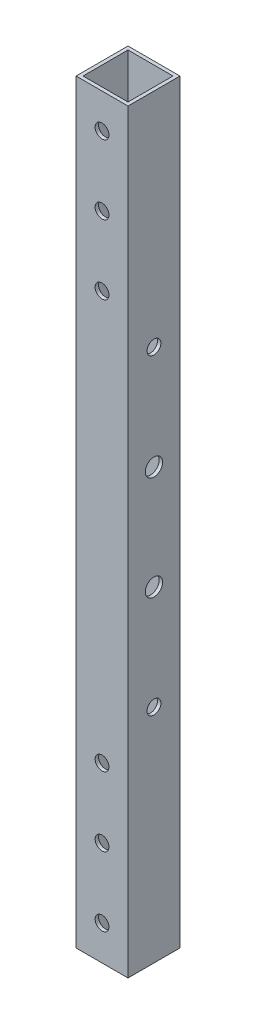
ISO-10303-21;
HEADER;
FILE_DESCRIPTION(('STEP AP214'),'2;1');
FILE_NAME('part.step','',(''),(''),'','','');
FILE_SCHEMA(('AUTOMOTIVE_DESIGN { 1 0 10303 214 1 1 1 1 }'));
ENDSEC;
DATA;
#1=APPLICATION_CONTEXT('core data for automotive mechanical design processes');
#2=APPLICATION_PROTOCOL_DEFINITION('international standard','automotive_design',2000,#1);
#3=PRODUCT_CONTEXT('',#1,'mechanical');
#4=PRODUCT('Part','Part','',(#3));
#5=PRODUCT_RELATED_PRODUCT_CATEGORY('part','',(#4));
#6=PRODUCT_DEFINITION_FORMATION('','',#4);
#7=PRODUCT_DEFINITION_CONTEXT('part definition',#1,'design');
#8=PRODUCT_DEFINITION('design','',#6,#7);
#9=PRODUCT_DEFINITION_SHAPE('','',#8);
#10=(LENGTH_UNIT() NAMED_UNIT(*) SI_UNIT(.MILLI.,.METRE.));
#11=(NAMED_UNIT(*) PLANE_ANGLE_UNIT() SI_UNIT($,.RADIAN.));
#12=(NAMED_UNIT(*) SI_UNIT($,.STERADIAN.) SOLID_ANGLE_UNIT());
#13=UNCERTAINTY_MEASURE_WITH_UNIT(LENGTH_MEASURE(1.E-05),#10,'distance_accuracy_value','');
#14=(GEOMETRIC_REPRESENTATION_CONTEXT(3) GLOBAL_UNCERTAINTY_ASSIGNED_CONTEXT((#13)) GLOBAL_UNIT_ASSIGNED_CONTEXT((#10,
#11,#12)) REPRESENTATION_CONTEXT('',''));
#15=CARTESIAN_POINT('',(0.,0.,0.));
#16=DIRECTION('',(0.,0.,1.));
#17=DIRECTION('',(1.,0.,0.));
#18=AXIS2_PLACEMENT_3D('',#15,#16,#17);
#19=CARTESIAN_POINT('',(0.,218.,0.));
#20=DIRECTION('',(0.,-1.,0.));
#21=DIRECTION('',(0.,0.,-1.));
#22=AXIS2_PLACEMENT_3D('',#19,#20,#21);
#23=PLANE('',#22);
#24=DIRECTION('',(0.,0.,-1.));
#25=VECTOR('',#24,1.);
#26=CARTESIAN_POINT('',(7.5,218.,7.5));
#27=LINE('',#26,#25);
#28=CARTESIAN_POINT('',(7.5,218.,7.5));
#29=VERTEX_POINT('',#28);
#30=CARTESIAN_POINT('',(7.5,218.,-7.5));
#31=VERTEX_POINT('',#30);
#32=EDGE_CURVE('E146',#29,#31,#27,.T.);
#33=ORIENTED_EDGE('',*,*,#32,.T.);
#34=DIRECTION('',(-1.,0.,0.));
#35=VECTOR('',#34,1.);
#36=CARTESIAN_POINT('',(-7.5,218.,-7.5));
#37=LINE('',#36,#35);
#38=CARTESIAN_POINT('',(-7.5,218.,-7.5));
#39=VERTEX_POINT('',#38);
#40=EDGE_CURVE('E149',#31,#39,#37,.T.);
#41=ORIENTED_EDGE('',*,*,#40,.T.);
#42=DIRECTION('',(0.,0.,1.));
#43=VECTOR('',#42,1.);
#44=CARTESIAN_POINT('',(-7.5,218.,7.5));
#45=LINE('',#44,#43);
#46=CARTESIAN_POINT('',(-7.5,218.,7.5));
#47=VERTEX_POINT('',#46);
#48=EDGE_CURVE('E152',#39,#47,#45,.T.);
#49=ORIENTED_EDGE('',*,*,#48,.T.);
#50=DIRECTION('',(1.,0.,0.));
#51=VECTOR('',#50,1.);
#52=CARTESIAN_POINT('',(-7.5,218.,7.5));
#53=LINE('',#52,#51);
#54=EDGE_CURVE('E154',#47,#29,#53,.T.);
#55=ORIENTED_EDGE('',*,*,#54,.T.);
#56=EDGE_LOOP('',(#33,#41,#49,#55));
#57=FACE_BOUND('',#56,.T.);
#58=DIRECTION('',(0.,0.,-1.));
#59=VECTOR('',#58,1.);
#60=CARTESIAN_POINT('',(6.5,218.,6.5));
#61=LINE('',#60,#59);
#62=CARTESIAN_POINT('',(6.5,218.,6.5));
#63=VERTEX_POINT('',#62);
#64=CARTESIAN_POINT('',(6.5,218.,-6.5));
#65=VERTEX_POINT('',#64);
#66=EDGE_CURVE('E108',#63,#65,#61,.T.);
#67=ORIENTED_EDGE('',*,*,#66,.F.);
#68=DIRECTION('',(1.,0.,0.));
#69=VECTOR('',#68,1.);
#70=CARTESIAN_POINT('',(-6.5,218.,6.5));
#71=LINE('',#70,#69);
#72=CARTESIAN_POINT('',(-6.5,218.,6.5));
#73=VERTEX_POINT('',#72);
#74=EDGE_CURVE('E130',#73,#63,#71,.T.);
#75=ORIENTED_EDGE('',*,*,#74,.F.);
#76=DIRECTION('',(0.,0.,1.));
#77=VECTOR('',#76,1.);
#78=CARTESIAN_POINT('',(-6.5,218.,6.5));
#79=LINE('',#78,#77);
#80=CARTESIAN_POINT('',(-6.5,218.,-6.5));
#81=VERTEX_POINT('',#80);
#82=EDGE_CURVE('E128',#81,#73,#79,.T.);
#83=ORIENTED_EDGE('',*,*,#82,.F.);
#84=DIRECTION('',(-1.,0.,0.));
#85=VECTOR('',#84,1.);
#86=CARTESIAN_POINT('',(-6.5,218.,-6.5));
#87=LINE('',#86,#85);
#88=EDGE_CURVE('E116',#65,#81,#87,.T.);
#89=ORIENTED_EDGE('',*,*,#88,.F.);
#90=EDGE_LOOP('',(#67,#75,#83,#89));
#91=FACE_BOUND('',#90,.T.);
#92=ADVANCED_FACE('F41',(#57,#91),#23,.F.);
#93=CARTESIAN_POINT('',(0.,0.,0.));
#94=DIRECTION('',(0.,-1.,0.));
#95=DIRECTION('',(0.,0.,-1.));
#96=AXIS2_PLACEMENT_3D('',#93,#94,#95);
#97=PLANE('',#96);
#98=DIRECTION('',(0.,0.,-1.));
#99=VECTOR('',#98,1.);
#100=CARTESIAN_POINT('',(7.5,0.,7.5));
#101=LINE('',#100,#99);
#102=CARTESIAN_POINT('',(7.5,0.,7.5));
#103=VERTEX_POINT('',#102);
#104=CARTESIAN_POINT('',(7.5,0.,-7.5));
#105=VERTEX_POINT('',#104);
#106=EDGE_CURVE('E124',#103,#105,#101,.T.);
#107=ORIENTED_EDGE('',*,*,#106,.F.);
#108=DIRECTION('',(1.,0.,0.));
#109=VECTOR('',#108,1.);
#110=CARTESIAN_POINT('',(-7.5,0.,7.5));
#111=LINE('',#110,#109);
#112=CARTESIAN_POINT('',(-7.5,0.,7.5));
#113=VERTEX_POINT('',#112);
#114=EDGE_CURVE('E150',#113,#103,#111,.T.);
#115=ORIENTED_EDGE('',*,*,#114,.F.);
#116=DIRECTION('',(0.,0.,1.));
#117=VECTOR('',#116,1.);
#118=CARTESIAN_POINT('',(-7.5,0.,7.5));
#119=LINE('',#118,#117);
#120=CARTESIAN_POINT('',(-7.5,0.,-7.5));
#121=VERTEX_POINT('',#120);
#122=EDGE_CURVE('E161',#121,#113,#119,.T.);
#123=ORIENTED_EDGE('',*,*,#122,.F.);
#124=DIRECTION('',(-1.,0.,0.));
#125=VECTOR('',#124,1.);
#126=CARTESIAN_POINT('',(-7.5,0.,-7.5));
#127=LINE('',#126,#125);
#128=EDGE_CURVE('E159',#105,#121,#127,.T.);
#129=ORIENTED_EDGE('',*,*,#128,.F.);
#130=EDGE_LOOP('',(#107,#115,#123,#129));
#131=FACE_BOUND('',#130,.T.);
#132=DIRECTION('',(1.,0.,0.));
#133=VECTOR('',#132,1.);
#134=CARTESIAN_POINT('',(-6.5,0.,6.5));
#135=LINE('',#134,#133);
#136=CARTESIAN_POINT('',(-6.5,0.,6.5));
#137=VERTEX_POINT('',#136);
#138=CARTESIAN_POINT('',(6.5,0.,6.5));
#139=VERTEX_POINT('',#138);
#140=EDGE_CURVE('E117',#137,#139,#135,.T.);
#141=ORIENTED_EDGE('',*,*,#140,.T.);
#142=DIRECTION('',(0.,0.,-1.));
#143=VECTOR('',#142,1.);
#144=CARTESIAN_POINT('',(6.5,0.,6.5));
#145=LINE('',#144,#143);
#146=CARTESIAN_POINT('',(6.5,0.,-6.5));
#147=VERTEX_POINT('',#146);
#148=EDGE_CURVE('E66',#139,#147,#145,.T.);
#149=ORIENTED_EDGE('',*,*,#148,.T.);
#150=DIRECTION('',(-1.,0.,0.));
#151=VECTOR('',#150,1.);
#152=CARTESIAN_POINT('',(-6.5,0.,-6.5));
#153=LINE('',#152,#151);
#154=CARTESIAN_POINT('',(-6.5,0.,-6.5));
#155=VERTEX_POINT('',#154);
#156=EDGE_CURVE('E123',#147,#155,#153,.T.);
#157=ORIENTED_EDGE('',*,*,#156,.T.);
#158=DIRECTION('',(0.,0.,1.));
#159=VECTOR('',#158,1.);
#160=CARTESIAN_POINT('',(-6.5,0.,6.5));
#161=LINE('',#160,#159);
#162=EDGE_CURVE('E138',#155,#137,#161,.T.);
#163=ORIENTED_EDGE('',*,*,#162,.T.);
#164=EDGE_LOOP('',(#141,#149,#157,#163));
#165=FACE_BOUND('',#164,.T.);
#166=ADVANCED_FACE('F307',(#131,#165),#97,.T.);
#167=CARTESIAN_POINT('',(7.5,218.,7.5));
#168=DIRECTION('',(-1.,0.,0.));
#169=DIRECTION('',(0.,0.,1.));
#170=AXIS2_PLACEMENT_3D('',#167,#168,#169);
#171=PLANE('',#170);
#172=CARTESIAN_POINT('',(7.5,64.,0.));
#173=DIRECTION('',(1.,0.,0.));
#174=DIRECTION('',(0.,0.,1.));
#175=AXIS2_PLACEMENT_3D('',#172,#173,#174);
#176=CIRCLE('',#175,2.);
#177=CARTESIAN_POINT('',(7.5,64.,2.));
#178=VERTEX_POINT('',#177);
#179=EDGE_CURVE('E352',#178,#178,#176,.T.);
#180=ORIENTED_EDGE('',*,*,#179,.F.);
#181=EDGE_LOOP('',(#180));
#182=FACE_BOUND('',#181,.T.);
#183=CARTESIAN_POINT('',(7.5,154.,0.));
#184=DIRECTION('',(1.,0.,0.));
#185=DIRECTION('',(0.,0.,-1.));
#186=AXIS2_PLACEMENT_3D('',#183,#184,#185);
#187=CIRCLE('',#186,2.);
#188=CARTESIAN_POINT('',(7.5,154.,-2.));
#189=VERTEX_POINT('',#188);
#190=EDGE_CURVE('E356',#189,#189,#187,.T.);
#191=ORIENTED_EDGE('',*,*,#190,.F.);
#192=EDGE_LOOP('',(#191));
#193=FACE_BOUND('',#192,.T.);
#194=CARTESIAN_POINT('',(7.5,94.,0.));
#195=DIRECTION('',(1.,0.,0.));
#196=DIRECTION('',(0.,0.,1.));
#197=AXIS2_PLACEMENT_3D('',#194,#195,#196);
#198=CIRCLE('',#197,2.5);
#199=CARTESIAN_POINT('',(7.5,94.,2.5));
#200=VERTEX_POINT('',#199);
#201=EDGE_CURVE('E360',#200,#200,#198,.T.);
#202=ORIENTED_EDGE('',*,*,#201,.F.);
#203=EDGE_LOOP('',(#202));
#204=FACE_BOUND('',#203,.T.);
#205=CARTESIAN_POINT('',(7.5,124.,0.));
#206=DIRECTION('',(1.,0.,0.));
#207=DIRECTION('',(0.,0.,-1.));
#208=AXIS2_PLACEMENT_3D('',#205,#206,#207);
#209=CIRCLE('',#208,2.5);
#210=CARTESIAN_POINT('',(7.5,124.,-2.5));
#211=VERTEX_POINT('',#210);
#212=EDGE_CURVE('E348',#211,#211,#209,.T.);
#213=ORIENTED_EDGE('',*,*,#212,.F.);
#214=EDGE_LOOP('',(#213));
#215=FACE_BOUND('',#214,.T.);
#216=ORIENTED_EDGE('',*,*,#106,.T.);
#217=DIRECTION('',(0.,-1.,0.));
#218=VECTOR('',#217,1.);
#219=CARTESIAN_POINT('',(7.5,218.,-7.5));
#220=LINE('',#219,#218);
#221=EDGE_CURVE('E11',#31,#105,#220,.T.);
#222=ORIENTED_EDGE('',*,*,#221,.F.);
#223=ORIENTED_EDGE('',*,*,#32,.F.);
#224=DIRECTION('',(0.,-1.,0.));
#225=VECTOR('',#224,1.);
#226=CARTESIAN_POINT('',(7.5,218.,7.5));
#227=LINE('',#226,#225);
#228=EDGE_CURVE('E156',#29,#103,#227,.T.);
#229=ORIENTED_EDGE('',*,*,#228,.T.);
#230=EDGE_LOOP('',(#216,#222,#223,#229));
#231=FACE_BOUND('',#230,.T.);
#232=ADVANCED_FACE('F43',(#182,#193,#204,#215,#231),#171,.F.);
#233=CARTESIAN_POINT('',(-7.5,218.,-7.5));
#234=DIRECTION('',(0.,0.,1.));
#235=DIRECTION('',(1.,0.,0.));
#236=AXIS2_PLACEMENT_3D('',#233,#234,#235);
#237=PLANE('',#236);
#238=CARTESIAN_POINT('',(0.,208.,-7.5));
#239=DIRECTION('',(0.,0.,1.));
#240=DIRECTION('',(1.,0.,0.));
#241=AXIS2_PLACEMENT_3D('',#238,#239,#240);
#242=CIRCLE('',#241,2.);
#243=CARTESIAN_POINT('',(1.99999999999998,208.,-7.5));
#244=VERTEX_POINT('',#243);
#245=EDGE_CURVE('E175',#244,#244,#242,.T.);
#246=ORIENTED_EDGE('',*,*,#245,.T.);
#247=EDGE_LOOP('',(#246));
#248=FACE_BOUND('',#247,.T.);
#249=CARTESIAN_POINT('',(0.,50.,-7.5));
#250=DIRECTION('',(0.,0.,1.));
#251=DIRECTION('',(-1.,0.,0.));
#252=AXIS2_PLACEMENT_3D('',#249,#250,#251);
#253=CIRCLE('',#252,2.);
#254=CARTESIAN_POINT('',(-2.00000000000002,50.,-7.5));
#255=VERTEX_POINT('',#254);
#256=EDGE_CURVE('E227',#255,#255,#253,.T.);
#257=ORIENTED_EDGE('',*,*,#256,.T.);
#258=EDGE_LOOP('',(#257));
#259=FACE_BOUND('',#258,.T.);
#260=CARTESIAN_POINT('',(0.,188.,-7.5));
#261=DIRECTION('',(0.,0.,1.));
#262=DIRECTION('',(1.,0.,0.));
#263=AXIS2_PLACEMENT_3D('',#260,#261,#262);
#264=CIRCLE('',#263,2.);
#265=CARTESIAN_POINT('',(1.99999999999999,188.,-7.5));
#266=VERTEX_POINT('',#265);
#267=EDGE_CURVE('E226',#266,#266,#264,.T.);
#268=ORIENTED_EDGE('',*,*,#267,.T.);
#269=EDGE_LOOP('',(#268));
#270=FACE_BOUND('',#269,.T.);
#271=CARTESIAN_POINT('',(0.,30.,-7.5));
#272=DIRECTION('',(0.,0.,1.));
#273=DIRECTION('',(-1.,0.,0.));
#274=AXIS2_PLACEMENT_3D('',#271,#272,#273);
#275=CIRCLE('',#274,2.);
#276=CARTESIAN_POINT('',(-2.,30.,-7.5));
#277=VERTEX_POINT('',#276);
#278=EDGE_CURVE('E250',#277,#277,#275,.T.);
#279=ORIENTED_EDGE('',*,*,#278,.T.);
#280=EDGE_LOOP('',(#279));
#281=FACE_BOUND('',#280,.T.);
#282=CARTESIAN_POINT('',(0.,10.,-7.5));
#283=DIRECTION('',(0.,0.,1.));
#284=DIRECTION('',(-1.,0.,0.));
#285=AXIS2_PLACEMENT_3D('',#282,#283,#284);
#286=CIRCLE('',#285,2.);
#287=CARTESIAN_POINT('',(-2.,10.,-7.5));
#288=VERTEX_POINT('',#287);
#289=EDGE_CURVE('E233',#288,#288,#286,.T.);
#290=ORIENTED_EDGE('',*,*,#289,.T.);
#291=EDGE_LOOP('',(#290));
#292=FACE_BOUND('',#291,.T.);
#293=CARTESIAN_POINT('',(0.,168.,-7.5));
#294=DIRECTION('',(0.,0.,1.));
#295=DIRECTION('',(1.,0.,0.));
#296=AXIS2_PLACEMENT_3D('',#293,#294,#295);
#297=CIRCLE('',#296,2.);
#298=CARTESIAN_POINT('',(1.99999999999999,168.,-7.5));
#299=VERTEX_POINT('',#298);
#300=EDGE_CURVE('E240',#299,#299,#297,.T.);
#301=ORIENTED_EDGE('',*,*,#300,.T.);
#302=EDGE_LOOP('',(#301));
#303=FACE_BOUND('',#302,.T.);
#304=ORIENTED_EDGE('',*,*,#128,.T.);
#305=DIRECTION('',(0.,-1.,0.));
#306=VECTOR('',#305,1.);
#307=CARTESIAN_POINT('',(-7.5,218.,-7.5));
#308=LINE('',#307,#306);
#309=EDGE_CURVE('E50',#39,#121,#308,.T.);
#310=ORIENTED_EDGE('',*,*,#309,.F.);
#311=ORIENTED_EDGE('',*,*,#40,.F.);
#312=ORIENTED_EDGE('',*,*,#221,.T.);
#313=EDGE_LOOP('',(#304,#310,#311,#312));
#314=FACE_BOUND('',#313,.T.);
#315=ADVANCED_FACE('F293',(#248,#259,#270,#281,#292,#303,#314),#237,.F.);
#316=CARTESIAN_POINT('',(-7.5,218.,7.5));
#317=DIRECTION('',(1.,0.,0.));
#318=DIRECTION('',(0.,0.,-1.));
#319=AXIS2_PLACEMENT_3D('',#316,#317,#318);
#320=PLANE('',#319);
#321=CARTESIAN_POINT('',(-7.5,64.,0.));
#322=DIRECTION('',(1.,0.,0.));
#323=DIRECTION('',(0.,0.,1.));
#324=AXIS2_PLACEMENT_3D('',#321,#322,#323);
#325=CIRCLE('',#324,2.);
#326=CARTESIAN_POINT('',(-7.5,64.,2.));
#327=VERTEX_POINT('',#326);
#328=EDGE_CURVE('E336',#327,#327,#325,.T.);
#329=ORIENTED_EDGE('',*,*,#328,.T.);
#330=EDGE_LOOP('',(#329));
#331=FACE_BOUND('',#330,.T.);
#332=CARTESIAN_POINT('',(-7.5,154.,0.));
#333=DIRECTION('',(1.,0.,0.));
#334=DIRECTION('',(0.,0.,-1.));
#335=AXIS2_PLACEMENT_3D('',#332,#333,#334);
#336=CIRCLE('',#335,2.);
#337=CARTESIAN_POINT('',(-7.5,154.,-2.));
#338=VERTEX_POINT('',#337);
#339=EDGE_CURVE('E340',#338,#338,#336,.T.);
#340=ORIENTED_EDGE('',*,*,#339,.T.);
#341=EDGE_LOOP('',(#340));
#342=FACE_BOUND('',#341,.T.);
#343=CARTESIAN_POINT('',(-7.5,94.,0.));
#344=DIRECTION('',(1.,0.,0.));
#345=DIRECTION('',(0.,0.,1.));
#346=AXIS2_PLACEMENT_3D('',#343,#344,#345);
#347=CIRCLE('',#346,2.5);
#348=CARTESIAN_POINT('',(-7.5,94.,2.5));
#349=VERTEX_POINT('',#348);
#350=EDGE_CURVE('E344',#349,#349,#347,.T.);
#351=ORIENTED_EDGE('',*,*,#350,.T.);
#352=EDGE_LOOP('',(#351));
#353=FACE_BOUND('',#352,.T.);
#354=CARTESIAN_POINT('',(-7.5,124.,0.));
#355=DIRECTION('',(1.,0.,0.));
#356=DIRECTION('',(0.,0.,-1.));
#357=AXIS2_PLACEMENT_3D('',#354,#355,#356);
#358=CIRCLE('',#357,2.5);
#359=CARTESIAN_POINT('',(-7.5,124.,-2.5));
#360=VERTEX_POINT('',#359);
#361=EDGE_CURVE('E199',#360,#360,#358,.T.);
#362=ORIENTED_EDGE('',*,*,#361,.T.);
#363=EDGE_LOOP('',(#362));
#364=FACE_BOUND('',#363,.T.);
#365=ORIENTED_EDGE('',*,*,#122,.T.);
#366=DIRECTION('',(0.,-1.,0.));
#367=VECTOR('',#366,1.);
#368=CARTESIAN_POINT('',(-7.5,218.,7.5));
#369=LINE('',#368,#367);
#370=EDGE_CURVE('E166',#47,#113,#369,.T.);
#371=ORIENTED_EDGE('',*,*,#370,.F.);
#372=ORIENTED_EDGE('',*,*,#48,.F.);
#373=ORIENTED_EDGE('',*,*,#309,.T.);
#374=EDGE_LOOP('',(#365,#371,#372,#373));
#375=FACE_BOUND('',#374,.T.);
#376=ADVANCED_FACE('F296',(#331,#342,#353,#364,#375),#320,.F.);
#377=CARTESIAN_POINT('',(-7.5,218.,7.5));
#378=DIRECTION('',(0.,0.,-1.));
#379=DIRECTION('',(-1.,0.,0.));
#380=AXIS2_PLACEMENT_3D('',#377,#378,#379);
#381=PLANE('',#380);
#382=CARTESIAN_POINT('',(0.,208.,7.5));
#383=DIRECTION('',(0.,0.,1.));
#384=DIRECTION('',(1.,0.,0.));
#385=AXIS2_PLACEMENT_3D('',#382,#383,#384);
#386=CIRCLE('',#385,2.);
#387=CARTESIAN_POINT('',(1.99999999999998,208.,7.5));
#388=VERTEX_POINT('',#387);
#389=EDGE_CURVE('E223',#388,#388,#386,.T.);
#390=ORIENTED_EDGE('',*,*,#389,.F.);
#391=EDGE_LOOP('',(#390));
#392=FACE_BOUND('',#391,.T.);
#393=CARTESIAN_POINT('',(0.,50.,7.5));
#394=DIRECTION('',(0.,0.,1.));
#395=DIRECTION('',(-1.,0.,0.));
#396=AXIS2_PLACEMENT_3D('',#393,#394,#395);
#397=CIRCLE('',#396,2.);
#398=CARTESIAN_POINT('',(-2.00000000000002,50.,7.5));
#399=VERTEX_POINT('',#398);
#400=EDGE_CURVE('E220',#399,#399,#397,.T.);
#401=ORIENTED_EDGE('',*,*,#400,.F.);
#402=EDGE_LOOP('',(#401));
#403=FACE_BOUND('',#402,.T.);
#404=CARTESIAN_POINT('',(0.,188.,7.5));
#405=DIRECTION('',(0.,0.,1.));
#406=DIRECTION('',(1.,0.,0.));
#407=AXIS2_PLACEMENT_3D('',#404,#405,#406);
#408=CIRCLE('',#407,2.);
#409=CARTESIAN_POINT('',(1.99999999999999,188.,7.5));
#410=VERTEX_POINT('',#409);
#411=EDGE_CURVE('E247',#410,#410,#408,.T.);
#412=ORIENTED_EDGE('',*,*,#411,.F.);
#413=EDGE_LOOP('',(#412));
#414=FACE_BOUND('',#413,.T.);
#415=CARTESIAN_POINT('',(0.,30.,7.5));
#416=DIRECTION('',(0.,0.,1.));
#417=DIRECTION('',(-1.,0.,0.));
#418=AXIS2_PLACEMENT_3D('',#415,#416,#417);
#419=CIRCLE('',#418,2.);
#420=CARTESIAN_POINT('',(-2.,30.,7.5));
#421=VERTEX_POINT('',#420);
#422=EDGE_CURVE('E236',#421,#421,#419,.T.);
#423=ORIENTED_EDGE('',*,*,#422,.F.);
#424=EDGE_LOOP('',(#423));
#425=FACE_BOUND('',#424,.T.);
#426=CARTESIAN_POINT('',(0.,10.,7.5));
#427=DIRECTION('',(0.,0.,1.));
#428=DIRECTION('',(-1.,0.,0.));
#429=AXIS2_PLACEMENT_3D('',#426,#427,#428);
#430=CIRCLE('',#429,2.);
#431=CARTESIAN_POINT('',(-2.,10.,7.5));
#432=VERTEX_POINT('',#431);
#433=EDGE_CURVE('E237',#432,#432,#430,.T.);
#434=ORIENTED_EDGE('',*,*,#433,.F.);
#435=EDGE_LOOP('',(#434));
#436=FACE_BOUND('',#435,.T.);
#437=CARTESIAN_POINT('',(0.,168.,7.5));
#438=DIRECTION('',(0.,0.,1.));
#439=DIRECTION('',(1.,0.,0.));
#440=AXIS2_PLACEMENT_3D('',#437,#438,#439);
#441=CIRCLE('',#440,2.);
#442=CARTESIAN_POINT('',(1.99999999999999,168.,7.5));
#443=VERTEX_POINT('',#442);
#444=EDGE_CURVE('E230',#443,#443,#441,.T.);
#445=ORIENTED_EDGE('',*,*,#444,.F.);
#446=EDGE_LOOP('',(#445));
#447=FACE_BOUND('',#446,.T.);
#448=ORIENTED_EDGE('',*,*,#114,.T.);
#449=ORIENTED_EDGE('',*,*,#228,.F.);
#450=ORIENTED_EDGE('',*,*,#54,.F.);
#451=ORIENTED_EDGE('',*,*,#370,.T.);
#452=EDGE_LOOP('',(#448,#449,#450,#451));
#453=FACE_BOUND('',#452,.T.);
#454=ADVANCED_FACE('F311',(#392,#403,#414,#425,#436,#447,#453),#381,.F.);
#455=CARTESIAN_POINT('',(6.5,218.,6.5));
#456=DIRECTION('',(-1.,0.,0.));
#457=DIRECTION('',(0.,0.,1.));
#458=AXIS2_PLACEMENT_3D('',#455,#456,#457);
#459=PLANE('',#458);
#460=CARTESIAN_POINT('',(6.5,64.,0.));
#461=DIRECTION('',(-1.,0.,0.));
#462=DIRECTION('',(0.,0.,1.));
#463=AXIS2_PLACEMENT_3D('',#460,#461,#462);
#464=CIRCLE('',#463,2.);
#465=CARTESIAN_POINT('',(6.5,64.,2.));
#466=VERTEX_POINT('',#465);
#467=EDGE_CURVE('E217',#466,#466,#464,.T.);
#468=ORIENTED_EDGE('',*,*,#467,.F.);
#469=EDGE_LOOP('',(#468));
#470=FACE_BOUND('',#469,.T.);
#471=CARTESIAN_POINT('',(6.5,154.,0.));
#472=DIRECTION('',(-1.,0.,0.));
#473=DIRECTION('',(0.,0.,1.));
#474=AXIS2_PLACEMENT_3D('',#471,#472,#473);
#475=CIRCLE('',#474,2.);
#476=CARTESIAN_POINT('',(6.5,154.,2.));
#477=VERTEX_POINT('',#476);
#478=EDGE_CURVE('E205',#477,#477,#475,.T.);
#479=ORIENTED_EDGE('',*,*,#478,.F.);
#480=EDGE_LOOP('',(#479));
#481=FACE_BOUND('',#480,.T.);
#482=CARTESIAN_POINT('',(6.5,94.,0.));
#483=DIRECTION('',(-1.,0.,0.));
#484=DIRECTION('',(0.,0.,1.));
#485=AXIS2_PLACEMENT_3D('',#482,#483,#484);
#486=CIRCLE('',#485,2.5);
#487=CARTESIAN_POINT('',(6.5,94.,2.5));
#488=VERTEX_POINT('',#487);
#489=EDGE_CURVE('E202',#488,#488,#486,.T.);
#490=ORIENTED_EDGE('',*,*,#489,.F.);
#491=EDGE_LOOP('',(#490));
#492=FACE_BOUND('',#491,.T.);
#493=CARTESIAN_POINT('',(6.5,124.,0.));
#494=DIRECTION('',(-1.,0.,0.));
#495=DIRECTION('',(0.,0.,1.));
#496=AXIS2_PLACEMENT_3D('',#493,#494,#495);
#497=CIRCLE('',#496,2.5);
#498=CARTESIAN_POINT('',(6.5,124.,2.5));
#499=VERTEX_POINT('',#498);
#500=EDGE_CURVE('E198',#499,#499,#497,.T.);
#501=ORIENTED_EDGE('',*,*,#500,.F.);
#502=EDGE_LOOP('',(#501));
#503=FACE_BOUND('',#502,.T.);
#504=ORIENTED_EDGE('',*,*,#148,.F.);
#505=DIRECTION('',(0.,-1.,0.));
#506=VECTOR('',#505,1.);
#507=CARTESIAN_POINT('',(6.5,218.,6.5));
#508=LINE('',#507,#506);
#509=EDGE_CURVE('E112',#63,#139,#508,.T.);
#510=ORIENTED_EDGE('',*,*,#509,.F.);
#511=ORIENTED_EDGE('',*,*,#66,.T.);
#512=DIRECTION('',(0.,-1.,0.));
#513=VECTOR('',#512,1.);
#514=CARTESIAN_POINT('',(6.5,218.,-6.5));
#515=LINE('',#514,#513);
#516=EDGE_CURVE('E111',#65,#147,#515,.T.);
#517=ORIENTED_EDGE('',*,*,#516,.T.);
#518=EDGE_LOOP('',(#504,#510,#511,#517));
#519=FACE_BOUND('',#518,.T.);
#520=ADVANCED_FACE('F110',(#470,#481,#492,#503,#519),#459,.T.);
#521=CARTESIAN_POINT('',(-6.5,218.,-6.5));
#522=DIRECTION('',(0.,0.,1.));
#523=DIRECTION('',(1.,0.,0.));
#524=AXIS2_PLACEMENT_3D('',#521,#522,#523);
#525=PLANE('',#524);
#526=CARTESIAN_POINT('',(0.,208.,-6.5));
#527=DIRECTION('',(0.,0.,1.));
#528=DIRECTION('',(1.,0.,0.));
#529=AXIS2_PLACEMENT_3D('',#526,#527,#528);
#530=CIRCLE('',#529,2.);
#531=CARTESIAN_POINT('',(1.99999999999998,208.,-6.5));
#532=VERTEX_POINT('',#531);
#533=EDGE_CURVE('E136',#532,#532,#530,.T.);
#534=ORIENTED_EDGE('',*,*,#533,.F.);
#535=EDGE_LOOP('',(#534));
#536=FACE_BOUND('',#535,.T.);
#537=CARTESIAN_POINT('',(0.,50.,-6.5));
#538=DIRECTION('',(0.,0.,1.));
#539=DIRECTION('',(1.,0.,0.));
#540=AXIS2_PLACEMENT_3D('',#537,#538,#539);
#541=CIRCLE('',#540,2.);
#542=CARTESIAN_POINT('',(1.99999999999998,50.,-6.5));
#543=VERTEX_POINT('',#542);
#544=EDGE_CURVE('E191',#543,#543,#541,.T.);
#545=ORIENTED_EDGE('',*,*,#544,.F.);
#546=EDGE_LOOP('',(#545));
#547=FACE_BOUND('',#546,.T.);
#548=CARTESIAN_POINT('',(0.,188.,-6.5));
#549=DIRECTION('',(0.,0.,1.));
#550=DIRECTION('',(1.,0.,0.));
#551=AXIS2_PLACEMENT_3D('',#548,#549,#550);
#552=CIRCLE('',#551,2.);
#553=CARTESIAN_POINT('',(1.99999999999999,188.,-6.5));
#554=VERTEX_POINT('',#553);
#555=EDGE_CURVE('E187',#554,#554,#552,.T.);
#556=ORIENTED_EDGE('',*,*,#555,.F.);
#557=EDGE_LOOP('',(#556));
#558=FACE_BOUND('',#557,.T.);
#559=CARTESIAN_POINT('',(0.,30.,-6.5));
#560=DIRECTION('',(0.,0.,1.));
#561=DIRECTION('',(1.,0.,0.));
#562=AXIS2_PLACEMENT_3D('',#559,#560,#561);
#563=CIRCLE('',#562,2.);
#564=CARTESIAN_POINT('',(2.,30.,-6.5));
#565=VERTEX_POINT('',#564);
#566=EDGE_CURVE('E183',#565,#565,#563,.T.);
#567=ORIENTED_EDGE('',*,*,#566,.F.);
#568=EDGE_LOOP('',(#567));
#569=FACE_BOUND('',#568,.T.);
#570=CARTESIAN_POINT('',(0.,10.,-6.5));
#571=DIRECTION('',(0.,0.,1.));
#572=DIRECTION('',(1.,0.,0.));
#573=AXIS2_PLACEMENT_3D('',#570,#571,#572);
#574=CIRCLE('',#573,2.);
#575=CARTESIAN_POINT('',(2.00000000000001,10.,-6.5));
#576=VERTEX_POINT('',#575);
#577=EDGE_CURVE('E179',#576,#576,#574,.T.);
#578=ORIENTED_EDGE('',*,*,#577,.F.);
#579=EDGE_LOOP('',(#578));
#580=FACE_BOUND('',#579,.T.);
#581=CARTESIAN_POINT('',(0.,168.,-6.5));
#582=DIRECTION('',(0.,0.,1.));
#583=DIRECTION('',(1.,0.,0.));
#584=AXIS2_PLACEMENT_3D('',#581,#582,#583);
#585=CIRCLE('',#584,2.);
#586=CARTESIAN_POINT('',(1.99999999999999,168.,-6.5));
#587=VERTEX_POINT('',#586);
#588=EDGE_CURVE('E174',#587,#587,#585,.T.);
#589=ORIENTED_EDGE('',*,*,#588,.F.);
#590=EDGE_LOOP('',(#589));
#591=FACE_BOUND('',#590,.T.);
#592=ORIENTED_EDGE('',*,*,#156,.F.);
#593=ORIENTED_EDGE('',*,*,#516,.F.);
#594=ORIENTED_EDGE('',*,*,#88,.T.);
#595=DIRECTION('',(0.,-1.,0.));
#596=VECTOR('',#595,1.);
#597=CARTESIAN_POINT('',(-6.5,218.,-6.5));
#598=LINE('',#597,#596);
#599=EDGE_CURVE('E125',#81,#155,#598,.T.);
#600=ORIENTED_EDGE('',*,*,#599,.T.);
#601=EDGE_LOOP('',(#592,#593,#594,#600));
#602=FACE_BOUND('',#601,.T.);
#603=ADVANCED_FACE('F120',(#536,#547,#558,#569,#580,#591,#602),#525,.T.);
#604=CARTESIAN_POINT('',(-6.5,218.,6.5));
#605=DIRECTION('',(1.,0.,0.));
#606=DIRECTION('',(0.,0.,-1.));
#607=AXIS2_PLACEMENT_3D('',#604,#605,#606);
#608=PLANE('',#607);
#609=CARTESIAN_POINT('',(-6.5,64.,0.));
#610=DIRECTION('',(1.,0.,0.));
#611=DIRECTION('',(0.,0.,-1.));
#612=AXIS2_PLACEMENT_3D('',#609,#610,#611);
#613=CIRCLE('',#612,2.);
#614=CARTESIAN_POINT('',(-6.5,64.,-2.));
#615=VERTEX_POINT('',#614);
#616=EDGE_CURVE('E45',#615,#615,#613,.T.);
#617=ORIENTED_EDGE('',*,*,#616,.F.);
#618=EDGE_LOOP('',(#617));
#619=FACE_BOUND('',#618,.T.);
#620=CARTESIAN_POINT('',(-6.5,154.,0.));
#621=DIRECTION('',(1.,0.,0.));
#622=DIRECTION('',(0.,0.,-1.));
#623=AXIS2_PLACEMENT_3D('',#620,#621,#622);
#624=CIRCLE('',#623,2.);
#625=CARTESIAN_POINT('',(-6.5,154.,-2.));
#626=VERTEX_POINT('',#625);
#627=EDGE_CURVE('E203',#626,#626,#624,.T.);
#628=ORIENTED_EDGE('',*,*,#627,.F.);
#629=EDGE_LOOP('',(#628));
#630=FACE_BOUND('',#629,.T.);
#631=CARTESIAN_POINT('',(-6.5,94.,0.));
#632=DIRECTION('',(1.,0.,0.));
#633=DIRECTION('',(0.,0.,-1.));
#634=AXIS2_PLACEMENT_3D('',#631,#632,#633);
#635=CIRCLE('',#634,2.5);
#636=CARTESIAN_POINT('',(-6.5,94.,-2.5));
#637=VERTEX_POINT('',#636);
#638=EDGE_CURVE('E200',#637,#637,#635,.T.);
#639=ORIENTED_EDGE('',*,*,#638,.F.);
#640=EDGE_LOOP('',(#639));
#641=FACE_BOUND('',#640,.T.);
#642=CARTESIAN_POINT('',(-6.5,124.,0.));
#643=DIRECTION('',(1.,0.,0.));
#644=DIRECTION('',(0.,0.,-1.));
#645=AXIS2_PLACEMENT_3D('',#642,#643,#644);
#646=CIRCLE('',#645,2.5);
#647=CARTESIAN_POINT('',(-6.5,124.,-2.5));
#648=VERTEX_POINT('',#647);
#649=EDGE_CURVE('E195',#648,#648,#646,.T.);
#650=ORIENTED_EDGE('',*,*,#649,.F.);
#651=EDGE_LOOP('',(#650));
#652=FACE_BOUND('',#651,.T.);
#653=ORIENTED_EDGE('',*,*,#162,.F.);
#654=ORIENTED_EDGE('',*,*,#599,.F.);
#655=ORIENTED_EDGE('',*,*,#82,.T.);
#656=DIRECTION('',(0.,-1.,0.));
#657=VECTOR('',#656,1.);
#658=CARTESIAN_POINT('',(-6.5,218.,6.5));
#659=LINE('',#658,#657);
#660=EDGE_CURVE('E58',#73,#137,#659,.T.);
#661=ORIENTED_EDGE('',*,*,#660,.T.);
#662=EDGE_LOOP('',(#653,#654,#655,#661));
#663=FACE_BOUND('',#662,.T.);
#664=ADVANCED_FACE('F272',(#619,#630,#641,#652,#663),#608,.T.);
#665=CARTESIAN_POINT('',(-6.5,218.,6.5));
#666=DIRECTION('',(0.,0.,-1.));
#667=DIRECTION('',(-1.,0.,0.));
#668=AXIS2_PLACEMENT_3D('',#665,#666,#667);
#669=PLANE('',#668);
#670=CARTESIAN_POINT('',(0.,208.,6.5));
#671=DIRECTION('',(0.,0.,-1.));
#672=DIRECTION('',(-1.,0.,0.));
#673=AXIS2_PLACEMENT_3D('',#670,#671,#672);
#674=CIRCLE('',#673,2.);
#675=CARTESIAN_POINT('',(-2.00000000000002,208.,6.5));
#676=VERTEX_POINT('',#675);
#677=EDGE_CURVE('E192',#676,#676,#674,.T.);
#678=ORIENTED_EDGE('',*,*,#677,.F.);
#679=EDGE_LOOP('',(#678));
#680=FACE_BOUND('',#679,.T.);
#681=CARTESIAN_POINT('',(0.,50.,6.5));
#682=DIRECTION('',(0.,0.,-1.));
#683=DIRECTION('',(-1.,0.,0.));
#684=AXIS2_PLACEMENT_3D('',#681,#682,#683);
#685=CIRCLE('',#684,2.);
#686=CARTESIAN_POINT('',(-2.00000000000002,50.,6.5));
#687=VERTEX_POINT('',#686);
#688=EDGE_CURVE('E188',#687,#687,#685,.T.);
#689=ORIENTED_EDGE('',*,*,#688,.F.);
#690=EDGE_LOOP('',(#689));
#691=FACE_BOUND('',#690,.T.);
#692=CARTESIAN_POINT('',(0.,188.,6.5));
#693=DIRECTION('',(0.,0.,-1.));
#694=DIRECTION('',(-1.,0.,0.));
#695=AXIS2_PLACEMENT_3D('',#692,#693,#694);
#696=CIRCLE('',#695,2.);
#697=CARTESIAN_POINT('',(-2.00000000000002,188.,6.5));
#698=VERTEX_POINT('',#697);
#699=EDGE_CURVE('E184',#698,#698,#696,.T.);
#700=ORIENTED_EDGE('',*,*,#699,.F.);
#701=EDGE_LOOP('',(#700));
#702=FACE_BOUND('',#701,.T.);
#703=CARTESIAN_POINT('',(0.,30.,6.5));
#704=DIRECTION('',(0.,0.,-1.));
#705=DIRECTION('',(-1.,0.,0.));
#706=AXIS2_PLACEMENT_3D('',#703,#704,#705);
#707=CIRCLE('',#706,2.);
#708=CARTESIAN_POINT('',(-2.,30.,6.5));
#709=VERTEX_POINT('',#708);
#710=EDGE_CURVE('E180',#709,#709,#707,.T.);
#711=ORIENTED_EDGE('',*,*,#710,.F.);
#712=EDGE_LOOP('',(#711));
#713=FACE_BOUND('',#712,.T.);
#714=CARTESIAN_POINT('',(0.,10.,6.5));
#715=DIRECTION('',(0.,0.,-1.));
#716=DIRECTION('',(-1.,0.,0.));
#717=AXIS2_PLACEMENT_3D('',#714,#715,#716);
#718=CIRCLE('',#717,2.);
#719=CARTESIAN_POINT('',(-2.,10.,6.5));
#720=VERTEX_POINT('',#719);
#721=EDGE_CURVE('E176',#720,#720,#718,.T.);
#722=ORIENTED_EDGE('',*,*,#721,.F.);
#723=EDGE_LOOP('',(#722));
#724=FACE_BOUND('',#723,.T.);
#725=CARTESIAN_POINT('',(0.,168.,6.5));
#726=DIRECTION('',(0.,0.,-1.));
#727=DIRECTION('',(-1.,0.,0.));
#728=AXIS2_PLACEMENT_3D('',#725,#726,#727);
#729=CIRCLE('',#728,2.);
#730=CARTESIAN_POINT('',(-2.00000000000002,168.,6.5));
#731=VERTEX_POINT('',#730);
#732=EDGE_CURVE('E171',#731,#731,#729,.T.);
#733=ORIENTED_EDGE('',*,*,#732,.F.);
#734=EDGE_LOOP('',(#733));
#735=FACE_BOUND('',#734,.T.);
#736=ORIENTED_EDGE('',*,*,#140,.F.);
#737=ORIENTED_EDGE('',*,*,#660,.F.);
#738=ORIENTED_EDGE('',*,*,#74,.T.);
#739=ORIENTED_EDGE('',*,*,#509,.T.);
#740=EDGE_LOOP('',(#736,#737,#738,#739));
#741=FACE_BOUND('',#740,.T.);
#742=ADVANCED_FACE('F402',(#680,#691,#702,#713,#724,#735,#741),#669,.T.);
#743=CARTESIAN_POINT('',(0.,168.,-7.5));
#744=DIRECTION('',(0.,0.,1.));
#745=DIRECTION('',(1.,0.,0.));
#746=AXIS2_PLACEMENT_3D('',#743,#744,#745);
#747=CYLINDRICAL_SURFACE('',#746,2.);
#748=ORIENTED_EDGE('',*,*,#732,.T.);
#749=EDGE_LOOP('',(#748));
#750=FACE_BOUND('',#749,.T.);
#751=ORIENTED_EDGE('',*,*,#444,.T.);
#752=EDGE_LOOP('',(#751));
#753=FACE_BOUND('',#752,.T.);
#754=ADVANCED_FACE('F290',(#750,#753),#747,.F.);
#755=CARTESIAN_POINT('',(0.,10.,-7.5));
#756=DIRECTION('',(0.,0.,1.));
#757=DIRECTION('',(1.,0.,0.));
#758=AXIS2_PLACEMENT_3D('',#755,#756,#757);
#759=CYLINDRICAL_SURFACE('',#758,2.);
#760=ORIENTED_EDGE('',*,*,#721,.T.);
#761=EDGE_LOOP('',(#760));
#762=FACE_BOUND('',#761,.T.);
#763=ORIENTED_EDGE('',*,*,#433,.T.);
#764=EDGE_LOOP('',(#763));
#765=FACE_BOUND('',#764,.T.);
#766=ADVANCED_FACE('F412',(#762,#765),#759,.F.);
#767=CARTESIAN_POINT('',(0.,30.,-7.5));
#768=DIRECTION('',(0.,0.,1.));
#769=DIRECTION('',(1.,0.,0.));
#770=AXIS2_PLACEMENT_3D('',#767,#768,#769);
#771=CYLINDRICAL_SURFACE('',#770,2.);
#772=ORIENTED_EDGE('',*,*,#710,.T.);
#773=EDGE_LOOP('',(#772));
#774=FACE_BOUND('',#773,.T.);
#775=ORIENTED_EDGE('',*,*,#422,.T.);
#776=EDGE_LOOP('',(#775));
#777=FACE_BOUND('',#776,.T.);
#778=ADVANCED_FACE('F417',(#774,#777),#771,.F.);
#779=CARTESIAN_POINT('',(0.,188.,-7.5));
#780=DIRECTION('',(0.,0.,1.));
#781=DIRECTION('',(1.,0.,0.));
#782=AXIS2_PLACEMENT_3D('',#779,#780,#781);
#783=CYLINDRICAL_SURFACE('',#782,2.);
#784=ORIENTED_EDGE('',*,*,#699,.T.);
#785=EDGE_LOOP('',(#784));
#786=FACE_BOUND('',#785,.T.);
#787=ORIENTED_EDGE('',*,*,#411,.T.);
#788=EDGE_LOOP('',(#787));
#789=FACE_BOUND('',#788,.T.);
#790=ADVANCED_FACE('F420',(#786,#789),#783,.F.);
#791=CARTESIAN_POINT('',(0.,50.,-7.5));
#792=DIRECTION('',(0.,0.,1.));
#793=DIRECTION('',(1.,0.,0.));
#794=AXIS2_PLACEMENT_3D('',#791,#792,#793);
#795=CYLINDRICAL_SURFACE('',#794,2.);
#796=ORIENTED_EDGE('',*,*,#688,.T.);
#797=EDGE_LOOP('',(#796));
#798=FACE_BOUND('',#797,.T.);
#799=ORIENTED_EDGE('',*,*,#400,.T.);
#800=EDGE_LOOP('',(#799));
#801=FACE_BOUND('',#800,.T.);
#802=ADVANCED_FACE('F424',(#798,#801),#795,.F.);
#803=CARTESIAN_POINT('',(0.,208.,-7.5));
#804=DIRECTION('',(0.,0.,1.));
#805=DIRECTION('',(1.,0.,0.));
#806=AXIS2_PLACEMENT_3D('',#803,#804,#805);
#807=CYLINDRICAL_SURFACE('',#806,2.);
#808=ORIENTED_EDGE('',*,*,#677,.T.);
#809=EDGE_LOOP('',(#808));
#810=FACE_BOUND('',#809,.T.);
#811=ORIENTED_EDGE('',*,*,#389,.T.);
#812=EDGE_LOOP('',(#811));
#813=FACE_BOUND('',#812,.T.);
#814=ADVANCED_FACE('F288',(#810,#813),#807,.F.);
#815=ORIENTED_EDGE('',*,*,#588,.T.);
#816=EDGE_LOOP('',(#815));
#817=FACE_BOUND('',#816,.T.);
#818=ORIENTED_EDGE('',*,*,#300,.F.);
#819=EDGE_LOOP('',(#818));
#820=FACE_BOUND('',#819,.T.);
#821=ADVANCED_FACE('F284',(#817,#820),#747,.F.);
#822=ORIENTED_EDGE('',*,*,#577,.T.);
#823=EDGE_LOOP('',(#822));
#824=FACE_BOUND('',#823,.T.);
#825=ORIENTED_EDGE('',*,*,#289,.F.);
#826=EDGE_LOOP('',(#825));
#827=FACE_BOUND('',#826,.T.);
#828=ADVANCED_FACE('F287',(#824,#827),#759,.F.);
#829=ORIENTED_EDGE('',*,*,#566,.T.);
#830=EDGE_LOOP('',(#829));
#831=FACE_BOUND('',#830,.T.);
#832=ORIENTED_EDGE('',*,*,#278,.F.);
#833=EDGE_LOOP('',(#832));
#834=FACE_BOUND('',#833,.T.);
#835=ADVANCED_FACE('F422',(#831,#834),#771,.F.);
#836=ORIENTED_EDGE('',*,*,#555,.T.);
#837=EDGE_LOOP('',(#836));
#838=FACE_BOUND('',#837,.T.);
#839=ORIENTED_EDGE('',*,*,#267,.F.);
#840=EDGE_LOOP('',(#839));
#841=FACE_BOUND('',#840,.T.);
#842=ADVANCED_FACE('F426',(#838,#841),#783,.F.);
#843=ORIENTED_EDGE('',*,*,#544,.T.);
#844=EDGE_LOOP('',(#843));
#845=FACE_BOUND('',#844,.T.);
#846=ORIENTED_EDGE('',*,*,#256,.F.);
#847=EDGE_LOOP('',(#846));
#848=FACE_BOUND('',#847,.T.);
#849=ADVANCED_FACE('F398',(#845,#848),#795,.F.);
#850=ORIENTED_EDGE('',*,*,#533,.T.);
#851=EDGE_LOOP('',(#850));
#852=FACE_BOUND('',#851,.T.);
#853=ORIENTED_EDGE('',*,*,#245,.F.);
#854=EDGE_LOOP('',(#853));
#855=FACE_BOUND('',#854,.T.);
#856=ADVANCED_FACE('F267',(#852,#855),#807,.F.);
#857=CARTESIAN_POINT('',(-7.5,124.,0.));
#858=DIRECTION('',(1.,0.,0.));
#859=DIRECTION('',(0.,0.,-1.));
#860=AXIS2_PLACEMENT_3D('',#857,#858,#859);
#861=CYLINDRICAL_SURFACE('',#860,2.5);
#862=ORIENTED_EDGE('',*,*,#649,.T.);
#863=EDGE_LOOP('',(#862));
#864=FACE_BOUND('',#863,.T.);
#865=ORIENTED_EDGE('',*,*,#361,.F.);
#866=EDGE_LOOP('',(#865));
#867=FACE_BOUND('',#866,.T.);
#868=ADVANCED_FACE('F376',(#864,#867),#861,.F.);
#869=CARTESIAN_POINT('',(-7.5,94.,0.));
#870=DIRECTION('',(1.,0.,0.));
#871=DIRECTION('',(0.,0.,-1.));
#872=AXIS2_PLACEMENT_3D('',#869,#870,#871);
#873=CYLINDRICAL_SURFACE('',#872,2.5);
#874=ORIENTED_EDGE('',*,*,#638,.T.);
#875=EDGE_LOOP('',(#874));
#876=FACE_BOUND('',#875,.T.);
#877=ORIENTED_EDGE('',*,*,#350,.F.);
#878=EDGE_LOOP('',(#877));
#879=FACE_BOUND('',#878,.T.);
#880=ADVANCED_FACE('F383',(#876,#879),#873,.F.);
#881=CARTESIAN_POINT('',(-7.5,154.,0.));
#882=DIRECTION('',(1.,0.,0.));
#883=DIRECTION('',(0.,0.,-1.));
#884=AXIS2_PLACEMENT_3D('',#881,#882,#883);
#885=CYLINDRICAL_SURFACE('',#884,2.);
#886=ORIENTED_EDGE('',*,*,#627,.T.);
#887=EDGE_LOOP('',(#886));
#888=FACE_BOUND('',#887,.T.);
#889=ORIENTED_EDGE('',*,*,#339,.F.);
#890=EDGE_LOOP('',(#889));
#891=FACE_BOUND('',#890,.T.);
#892=ADVANCED_FACE('F384',(#888,#891),#885,.F.);
#893=CARTESIAN_POINT('',(-7.5,64.,0.));
#894=DIRECTION('',(1.,0.,0.));
#895=DIRECTION('',(0.,0.,-1.));
#896=AXIS2_PLACEMENT_3D('',#893,#894,#895);
#897=CYLINDRICAL_SURFACE('',#896,2.);
#898=ORIENTED_EDGE('',*,*,#616,.T.);
#899=EDGE_LOOP('',(#898));
#900=FACE_BOUND('',#899,.T.);
#901=ORIENTED_EDGE('',*,*,#328,.F.);
#902=EDGE_LOOP('',(#901));
#903=FACE_BOUND('',#902,.T.);
#904=ADVANCED_FACE('F373',(#900,#903),#897,.F.);
#905=ORIENTED_EDGE('',*,*,#500,.T.);
#906=EDGE_LOOP('',(#905));
#907=FACE_BOUND('',#906,.T.);
#908=ORIENTED_EDGE('',*,*,#212,.T.);
#909=EDGE_LOOP('',(#908));
#910=FACE_BOUND('',#909,.T.);
#911=ADVANCED_FACE('F371',(#907,#910),#861,.F.);
#912=ORIENTED_EDGE('',*,*,#489,.T.);
#913=EDGE_LOOP('',(#912));
#914=FACE_BOUND('',#913,.T.);
#915=ORIENTED_EDGE('',*,*,#201,.T.);
#916=EDGE_LOOP('',(#915));
#917=FACE_BOUND('',#916,.T.);
#918=ADVANCED_FACE('F365',(#914,#917),#873,.F.);
#919=ORIENTED_EDGE('',*,*,#478,.T.);
#920=EDGE_LOOP('',(#919));
#921=FACE_BOUND('',#920,.T.);
#922=ORIENTED_EDGE('',*,*,#190,.T.);
#923=EDGE_LOOP('',(#922));
#924=FACE_BOUND('',#923,.T.);
#925=ADVANCED_FACE('F381',(#921,#924),#885,.F.);
#926=ORIENTED_EDGE('',*,*,#467,.T.);
#927=EDGE_LOOP('',(#926));
#928=FACE_BOUND('',#927,.T.);
#929=ORIENTED_EDGE('',*,*,#179,.T.);
#930=EDGE_LOOP('',(#929));
#931=FACE_BOUND('',#930,.T.);
#932=ADVANCED_FACE('F387',(#928,#931),#897,.F.);
#933=CLOSED_SHELL('',(#92,#166,#232,#315,#376,#454,#520,#603,#664,#742,#754,#766,#778,#790,#802,
#814,#821,#828,#835,#842,#849,#856,#868,#880,#892,#904,#911,#918,#925,#932));
#934=MANIFOLD_SOLID_BREP('B2',#933);
#935=ADVANCED_BREP_SHAPE_REPRESENTATION('',(#18,#934),#14);
#936=SHAPE_DEFINITION_REPRESENTATION(#9,#935);
ENDSEC;
END-ISO-10303-21;
